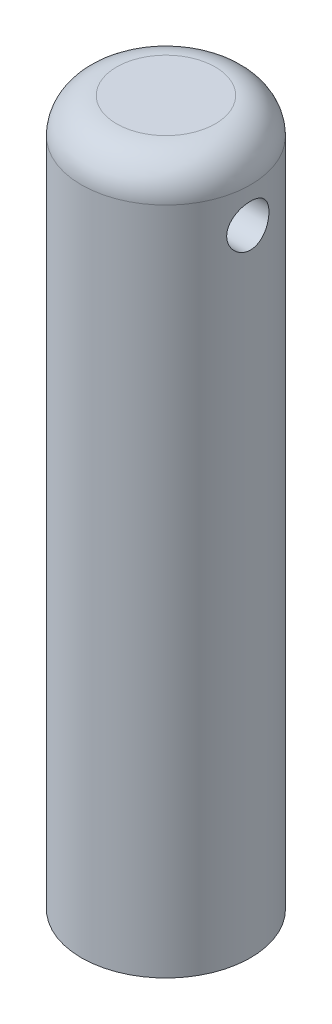
ISO-10303-21;
HEADER;
FILE_DESCRIPTION(('STEP AP214'),'2;1');
FILE_NAME('part.step','',(''),(''),'','','');
FILE_SCHEMA(('AUTOMOTIVE_DESIGN { 1 0 10303 214 1 1 1 1 }'));
ENDSEC;
DATA;
#1=APPLICATION_CONTEXT('core data for automotive mechanical design processes');
#2=APPLICATION_PROTOCOL_DEFINITION('international standard','automotive_design',2000,#1);
#3=PRODUCT_CONTEXT('',#1,'mechanical');
#4=PRODUCT('Part','Part','',(#3));
#5=PRODUCT_RELATED_PRODUCT_CATEGORY('part','',(#4));
#6=PRODUCT_DEFINITION_FORMATION('','',#4);
#7=PRODUCT_DEFINITION_CONTEXT('part definition',#1,'design');
#8=PRODUCT_DEFINITION('design','',#6,#7);
#9=PRODUCT_DEFINITION_SHAPE('','',#8);
#10=(LENGTH_UNIT() NAMED_UNIT(*) SI_UNIT(.MILLI.,.METRE.));
#11=(NAMED_UNIT(*) PLANE_ANGLE_UNIT() SI_UNIT($,.RADIAN.));
#12=(NAMED_UNIT(*) SI_UNIT($,.STERADIAN.) SOLID_ANGLE_UNIT());
#13=UNCERTAINTY_MEASURE_WITH_UNIT(LENGTH_MEASURE(1.E-05),#10,'distance_accuracy_value','');
#14=(GEOMETRIC_REPRESENTATION_CONTEXT(3) GLOBAL_UNCERTAINTY_ASSIGNED_CONTEXT((#13)) GLOBAL_UNIT_ASSIGNED_CONTEXT((#10,
#11,#12)) REPRESENTATION_CONTEXT('',''));
#15=CARTESIAN_POINT('',(0.,0.,0.));
#16=DIRECTION('',(0.,0.,1.));
#17=DIRECTION('',(1.,0.,0.));
#18=AXIS2_PLACEMENT_3D('',#15,#16,#17);
#19=CARTESIAN_POINT('',(0.,80.,0.));
#20=DIRECTION('',(0.,-1.,0.));
#21=DIRECTION('',(0.,0.,-1.));
#22=AXIS2_PLACEMENT_3D('',#19,#20,#21);
#23=CYLINDRICAL_SURFACE('',#22,6.);
#24=CARTESIAN_POINT('',(0.,80.,0.));
#25=DIRECTION('',(0.,1.,0.));
#26=DIRECTION('',(0.,0.,1.));
#27=AXIS2_PLACEMENT_3D('',#24,#25,#26);
#28=CIRCLE('',#27,6.);
#29=CARTESIAN_POINT('',(0.,80.,6.));
#30=VERTEX_POINT('',#29);
#31=EDGE_CURVE('E448',#30,#30,#28,.T.);
#32=ORIENTED_EDGE('',*,*,#31,.T.);
#33=EDGE_LOOP('',(#32));
#34=FACE_BOUND('',#33,.T.);
#35=CARTESIAN_POINT('',(0.,17.,0.));
#36=DIRECTION('',(0.,-1.,0.));
#37=DIRECTION('',(0.,0.,-1.));
#38=AXIS2_PLACEMENT_3D('',#35,#36,#37);
#39=CIRCLE('',#38,6.);
#40=CARTESIAN_POINT('',(0.,17.,-6.));
#41=VERTEX_POINT('',#40);
#42=EDGE_CURVE('E168',#41,#41,#39,.T.);
#43=ORIENTED_EDGE('',*,*,#42,.T.);
#44=EDGE_LOOP('',(#43));
#45=FACE_BOUND('',#44,.T.);
#46=ADVANCED_FACE('F32',(#34,#45),#23,.F.);
#47=CARTESIAN_POINT('',(0.,0.,0.));
#48=DIRECTION('',(0.,1.,0.));
#49=DIRECTION('',(0.,0.,1.));
#50=AXIS2_PLACEMENT_3D('',#47,#48,#49);
#51=PLANE('',#50);
#52=DIRECTION('',(-0.00445716423459127,0.,0.999990066794159));
#53=VECTOR('',#52,1.);
#54=CARTESIAN_POINT('',(6.88362585408213,0.,-3.93345923603692));
#55=LINE('',#54,#53);
#56=CARTESIAN_POINT('',(6.88105250911146,0.,-3.35611470178636));
#57=VERTEX_POINT('',#56);
#58=CARTESIAN_POINT('',(6.85086189517023,0.,3.41732070751345));
#59=VERTEX_POINT('',#58);
#60=EDGE_CURVE('E447',#57,#59,#55,.T.);
#61=ORIENTED_EDGE('',*,*,#60,.F.);
#62=CARTESIAN_POINT('',(5.8810624423173,0.,-3.36057186602095));
#63=DIRECTION('',(0.,1.,0.));
#64=DIRECTION('',(0.,0.,1.));
#65=AXIS2_PLACEMENT_3D('',#62,#63,#64);
#66=CIRCLE('',#65,1.);
#67=CARTESIAN_POINT('',(6.38491749317037,0.,-4.2243600852795));
#68=VERTEX_POINT('',#67);
#69=EDGE_CURVE('E206',#57,#68,#66,.T.);
#70=ORIENTED_EDGE('',*,*,#69,.T.);
#71=DIRECTION('',(0.863788219258543,0.,0.503855050853075));
#72=VECTOR('',#71,1.);
#73=CARTESIAN_POINT('',(0.0353373038825518,0.,-7.92812447780094));
#74=LINE('',#73,#72);
#75=CARTESIAN_POINT('',(0.534045664794298,0.,-7.63722362855836));
#76=VERTEX_POINT('',#75);
#77=EDGE_CURVE('E427',#76,#68,#74,.T.);
#78=ORIENTED_EDGE('',*,*,#77,.F.);
#79=CARTESIAN_POINT('',(0.030190613941224,0.,-6.77343540929982));
#80=DIRECTION('',(0.,1.,0.));
#81=DIRECTION('',(0.,0.,1.));
#82=AXIS2_PLACEMENT_3D('',#79,#80,#81);
#83=CIRCLE('',#82,1.);
#84=CARTESIAN_POINT('',(-0.46594440199986,0.,-7.64168079279295));
#85=VERTEX_POINT('',#84);
#86=EDGE_CURVE('E137',#76,#85,#83,.T.);
#87=ORIENTED_EDGE('',*,*,#86,.T.);
#88=DIRECTION('',(0.868245383493135,0.,-0.496135015941084));
#89=VECTOR('',#88,1.);
#90=CARTESIAN_POINT('',(-6.84828855019957,0.,-3.99466524176401));
#91=LINE('',#90,#89);
#92=CARTESIAN_POINT('',(-6.34700684431716,0.,-4.281108926772));
#93=VERTEX_POINT('',#92);
#94=EDGE_CURVE('E144',#93,#85,#91,.T.);
#95=ORIENTED_EDGE('',*,*,#94,.F.);
#96=CARTESIAN_POINT('',(-5.85087182837608,0.,-3.41286354327886));
#97=DIRECTION('',(0.,1.,0.));
#98=DIRECTION('',(0.,0.,1.));
#99=AXIS2_PLACEMENT_3D('',#96,#97,#98);
#100=CIRCLE('',#99,1.);
#101=CARTESIAN_POINT('',(-6.85086189517024,0.,-3.41732070751345));
#102=VERTEX_POINT('',#101);
#103=EDGE_CURVE('E129',#93,#102,#100,.T.);
#104=ORIENTED_EDGE('',*,*,#103,.T.);
#105=DIRECTION('',(0.00445716423459127,0.,-0.999990066794159));
#106=VECTOR('',#105,1.);
#107=CARTESIAN_POINT('',(-6.88362585408213,0.,3.93345923603692));
#108=LINE('',#107,#106);
#109=CARTESIAN_POINT('',(-6.88105250911146,0.,3.35611470178637));
#110=VERTEX_POINT('',#109);
#111=EDGE_CURVE('E156',#110,#102,#108,.T.);
#112=ORIENTED_EDGE('',*,*,#111,.F.);
#113=CARTESIAN_POINT('',(-5.8810624423173,0.,3.36057186602096));
#114=DIRECTION('',(0.,1.,0.));
#115=DIRECTION('',(0.,0.,1.));
#116=AXIS2_PLACEMENT_3D('',#113,#114,#115);
#117=CIRCLE('',#116,1.);
#118=CARTESIAN_POINT('',(-6.38491749317038,0.,4.2243600852795));
#119=VERTEX_POINT('',#118);
#120=EDGE_CURVE('E53',#110,#119,#117,.T.);
#121=ORIENTED_EDGE('',*,*,#120,.T.);
#122=DIRECTION('',(-0.863788219258544,0.,-0.503855050853075));
#123=VECTOR('',#122,1.);
#124=CARTESIAN_POINT('',(-0.0353373038825544,0.,7.92812447780094));
#125=LINE('',#124,#123);
#126=CARTESIAN_POINT('',(-0.534045664794303,0.,7.63722362855836));
#127=VERTEX_POINT('',#126);
#128=EDGE_CURVE('E161',#127,#119,#125,.T.);
#129=ORIENTED_EDGE('',*,*,#128,.F.);
#130=CARTESIAN_POINT('',(-0.0301906139412279,0.,6.77343540929982));
#131=DIRECTION('',(0.,1.,0.));
#132=DIRECTION('',(0.,0.,1.));
#133=AXIS2_PLACEMENT_3D('',#130,#131,#132);
#134=CIRCLE('',#133,1.);
#135=CARTESIAN_POINT('',(0.465944401999855,0.,7.64168079279295));
#136=VERTEX_POINT('',#135);
#137=EDGE_CURVE('E61',#127,#136,#134,.T.);
#138=ORIENTED_EDGE('',*,*,#137,.T.);
#139=DIRECTION('',(-0.868245383493135,0.,0.496135015941084));
#140=VECTOR('',#139,1.);
#141=CARTESIAN_POINT('',(6.84828855019957,0.,3.99466524176401));
#142=LINE('',#141,#140);
#143=CARTESIAN_POINT('',(6.34700684431716,0.,4.281108926772));
#144=VERTEX_POINT('',#143);
#145=EDGE_CURVE('E450',#144,#136,#142,.T.);
#146=ORIENTED_EDGE('',*,*,#145,.F.);
#147=CARTESIAN_POINT('',(5.85087182837608,0.,3.41286354327886));
#148=DIRECTION('',(0.,1.,0.));
#149=DIRECTION('',(0.,0.,1.));
#150=AXIS2_PLACEMENT_3D('',#147,#148,#149);
#151=CIRCLE('',#150,1.);
#152=EDGE_CURVE('E208',#144,#59,#151,.T.);
#153=ORIENTED_EDGE('',*,*,#152,.T.);
#154=EDGE_LOOP('',(#61,#70,#78,#87,#95,#104,#112,#121,#129,#138,#146,#153));
#155=FACE_BOUND('',#154,.T.);
#156=CARTESIAN_POINT('',(0.,0.,0.));
#157=DIRECTION('',(0.,1.,0.));
#158=DIRECTION('',(0.,0.,1.));
#159=AXIS2_PLACEMENT_3D('',#156,#157,#158);
#160=CIRCLE('',#159,12.);
#161=CARTESIAN_POINT('',(0.,0.,12.));
#162=VERTEX_POINT('',#161);
#163=EDGE_CURVE('E165',#162,#162,#160,.T.);
#164=ORIENTED_EDGE('',*,*,#163,.F.);
#165=EDGE_LOOP('',(#164));
#166=FACE_BOUND('',#165,.T.);
#167=ADVANCED_FACE('F152',(#155,#166),#51,.F.);
#168=CARTESIAN_POINT('',(0.,80.,0.));
#169=DIRECTION('',(0.,-1.,0.));
#170=DIRECTION('',(0.,0.,-1.));
#171=AXIS2_PLACEMENT_3D('',#168,#169,#170);
#172=CYLINDRICAL_SURFACE('',#171,12.);
#173=CARTESIAN_POINT('',(-11.6189500386223,90.,-3.));
#174=CARTESIAN_POINT('',(-11.6189532010543,90.1656609011119,-2.99999529431169));
#175=CARTESIAN_POINT('',(-11.6225316721752,90.3313738784142,-2.98623149459718));
#176=CARTESIAN_POINT('',(-11.6364223439108,90.6580410938082,-2.93162775055655));
#177=CARTESIAN_POINT('',(-11.6467384634596,90.8189925053618,-2.89077204809053));
#178=CARTESIAN_POINT('',(-11.6728646951538,91.1313642458246,-2.78338943955845));
#179=CARTESIAN_POINT('',(-11.6886677122855,91.2827965864629,-2.71689567342539));
#180=CARTESIAN_POINT('',(-11.7239783043451,91.5723730230479,-2.56022536951367));
#181=CARTESIAN_POINT('',(-11.7434860365419,91.7105165544963,-2.47004782627283));
#182=CARTESIAN_POINT('',(-11.7844885962675,91.9726339743147,-2.26645011277426));
#183=CARTESIAN_POINT('',(-11.8060151714764,92.0962723204201,-2.15260426524486));
#184=CARTESIAN_POINT('',(-11.8483545061835,92.3229136732324,-1.9058184769208));
#185=CARTESIAN_POINT('',(-11.8691671987967,92.4259147507461,-1.77287675301637));
#186=CARTESIAN_POINT('',(-11.908084986247,92.6097305611575,-1.48937424129475));
#187=CARTESIAN_POINT('',(-11.9261482488071,92.6902156657938,-1.33859349143414));
#188=CARTESIAN_POINT('',(-11.9571697431118,92.8245715729837,-1.02511582115131));
#189=CARTESIAN_POINT('',(-11.9701287280121,92.8784463022986,-0.862420662950327));
#190=CARTESIAN_POINT('',(-11.9892571061782,92.9569774014943,-0.533230510504993));
#191=CARTESIAN_POINT('',(-11.9955587261318,92.9822035731919,-0.36687926345877));
#192=CARTESIAN_POINT('',(-12.0011231292876,93.0045100551307,-0.0321945831153228));
#193=CARTESIAN_POINT('',(-12.0003869531605,93.0015945266515,0.136138553445682));
#194=CARTESIAN_POINT('',(-11.9920571394424,92.9681101796998,0.466056741517162));
#195=CARTESIAN_POINT('',(-11.9846160280904,92.9381564099354,0.627708646803201));
#196=CARTESIAN_POINT('',(-11.9638900382983,92.8524344759418,0.943614742241058));
#197=CARTESIAN_POINT('',(-11.9506048487814,92.7966649375471,1.09786853811131));
#198=CARTESIAN_POINT('',(-11.9194501164106,92.6603969151755,1.39622011050542));
#199=CARTESIAN_POINT('',(-11.9015402363401,92.5796795464059,1.54021352929951));
#200=CARTESIAN_POINT('',(-11.8630788457163,92.3959731850605,1.81282686702146));
#201=CARTESIAN_POINT('',(-11.8425268758318,92.2929803177272,1.94144410525651));
#202=CARTESIAN_POINT('',(-11.8003645652323,92.0643495096212,2.18332210525486));
#203=CARTESIAN_POINT('',(-11.7787406343036,91.9381741291827,2.29607303722559));
#204=CARTESIAN_POINT('',(-11.7373805222079,91.6684800317517,2.49892912788907));
#205=CARTESIAN_POINT('',(-11.7176444292995,91.5249605046107,2.58903322813808));
#206=CARTESIAN_POINT('',(-11.6822459619518,91.2236519590214,2.74436438706776));
#207=CARTESIAN_POINT('',(-11.6666038046041,91.0657971236246,2.80946870091135));
#208=CARTESIAN_POINT('',(-11.641423681784,90.7408974383078,2.91205686190914));
#209=CARTESIAN_POINT('',(-11.6318844101128,90.5738545632185,2.94954661965919));
#210=CARTESIAN_POINT('',(-11.6202642720895,90.2400485981641,2.99499556639911));
#211=CARTESIAN_POINT('',(-11.6179930677232,90.0733946479908,3.00370856870295));
#212=CARTESIAN_POINT('',(-11.6206481203763,89.7410136760977,2.9934203886182));
#213=CARTESIAN_POINT('',(-11.6255737148436,89.5752865704607,2.97442175741977));
#214=CARTESIAN_POINT('',(-11.6418849838198,89.2522628820617,2.90991055672591));
#215=CARTESIAN_POINT('',(-11.6531636429104,89.094872728117,2.86483688193829));
#216=CARTESIAN_POINT('',(-11.6808086191537,88.789882250576,2.74994169800456));
#217=CARTESIAN_POINT('',(-11.6971755389569,88.6422830891331,2.680117257255));
#218=CARTESIAN_POINT('',(-11.7335536451461,88.3578704665597,2.51612480152392));
#219=CARTESIAN_POINT('',(-11.7536300232869,88.2213253919484,2.42150610460277));
#220=CARTESIAN_POINT('',(-11.7950049968534,87.9657739646382,2.21118087880336));
#221=CARTESIAN_POINT('',(-11.8163037927397,87.8467705000199,2.09547088441631));
#222=CARTESIAN_POINT('',(-11.8583688363813,87.6266267489149,1.84278816295418));
#223=CARTESIAN_POINT('',(-11.8791084247426,87.5260079249414,1.70535585759478));
#224=CARTESIAN_POINT('',(-11.9171665993643,87.3492769596585,1.41510804808403));
#225=CARTESIAN_POINT('',(-11.9344853640474,87.2731635400701,1.26229334687278));
#226=CARTESIAN_POINT('',(-11.9636413888599,87.1482647585665,0.946674605193275));
#227=CARTESIAN_POINT('',(-11.9755179602689,87.0992828587451,0.783952143083649));
#228=CARTESIAN_POINT('',(-11.9926235207495,87.0294475984699,0.452249280956423));
#229=CARTESIAN_POINT('',(-11.9978537927211,87.0085888095131,0.283270095123724));
#230=CARTESIAN_POINT('',(-12.0010250822642,86.9958972312734,-0.0512505793299682));
#231=CARTESIAN_POINT('',(-11.9991593663997,87.0032948727138,-0.216761480898065));
#232=CARTESIAN_POINT('',(-11.9887768937233,87.045143481883,-0.544102489244252));
#233=CARTESIAN_POINT('',(-11.9802603347151,87.0795936450395,-0.705932705342784));
#234=CARTESIAN_POINT('',(-11.9575629856167,87.1741566593126,-1.02051310693432));
#235=CARTESIAN_POINT('',(-11.9434129350718,87.2341303599431,-1.17330748374259));
#236=CARTESIAN_POINT('',(-11.9109386674097,87.3779117370587,-1.46675115912487));
#237=CARTESIAN_POINT('',(-11.8926139241627,87.4617224180114,-1.6073989237969));
#238=CARTESIAN_POINT('',(-11.8532174904086,87.6531457019884,-1.87620578526991));
#239=CARTESIAN_POINT('',(-11.8320905082499,87.7612804287115,-2.00398496489501));
#240=CARTESIAN_POINT('',(-11.7897194717157,87.997268555932,-2.23984506082052));
#241=CARTESIAN_POINT('',(-11.7684753890191,88.1251269483335,-2.34792097522978));
#242=CARTESIAN_POINT('',(-11.7278242753651,88.3998042425684,-2.5432860794155));
#243=CARTESIAN_POINT('',(-11.7084589101987,88.5469323700958,-2.63014985824914));
#244=CARTESIAN_POINT('',(-11.6743186648448,88.8541664696245,-2.77778068975641));
#245=CARTESIAN_POINT('',(-11.6595404469964,89.0142628982815,-2.83856672925646));
#246=CARTESIAN_POINT('',(-11.6385572625221,89.3117310355055,-2.92326758571301));
#247=CARTESIAN_POINT('',(-11.631259890105,89.4476794931584,-2.95197951179064));
#248=CARTESIAN_POINT('',(-11.6214551574786,89.7224066069931,-2.99034687771531));
#249=CARTESIAN_POINT('',(-11.6189473886732,89.8611850207332,-3.00000394311525));
#250=CARTESIAN_POINT('',(-11.6189500386223,90.,-3.));
#251=B_SPLINE_CURVE_WITH_KNOTS('',3,(#173,#174,#175,#176,#177,#178,#179,#180,#181,#182,#183,
#184,#185,#186,#187,#188,#189,#190,#191,#192,#193,#194,#195,#196,#197,#198,#199,#200,#201,#202,
#203,#204,#205,#206,#207,#208,#209,#210,#211,#212,#213,#214,#215,#216,#217,#218,#219,#220,#221,
#222,#223,#224,#225,#226,#227,#228,#229,#230,#231,#232,#233,#234,#235,#236,#237,#238,#239,#240,
#241,#242,#243,#244,#245,#246,#247,#248,#249,#250),.UNSPECIFIED.,.T.,.F.,(4,2,2,2,2,2,2,2,2,2,2,
2,2,2,2,2,2,2,2,2,2,2,2,2,2,2,2,2,2,2,2,2,2,2,2,2,2,2,4),(0.,0.496472930083368,
0.993234889714398,1.48935687259922,1.98549992106574,2.49148745031572,2.9975222577584,
3.51061795677505,4.02363791816511,4.52626501194416,5.02881778399225,5.52021915226737,
6.01164668069743,6.50751449105333,7.00346862562696,7.51284559886294,8.02224637439762,
8.53411718410083,9.04587840155456,9.54412289717042,10.042321526265,10.5323688601698,
11.0224742571164,11.5221941503692,12.0219962266799,12.5343039716432,13.046584988694,
13.5551048737425,14.0635265869678,14.5582013535888,15.0528614085831,15.5448585187759,
16.0369176689162,16.5407651590442,17.0447403788455,17.5581177274936,18.0711206565002,
18.4871739262287,18.903191701295),.UNSPECIFIED.);
#252=CARTESIAN_POINT('',(-11.6189500386223,90.,-3.));
#253=VERTEX_POINT('',#252);
#254=EDGE_CURVE('E36',#253,#253,#251,.T.);
#255=ORIENTED_EDGE('',*,*,#254,.T.);
#256=EDGE_LOOP('',(#255));
#257=FACE_BOUND('',#256,.T.);
#258=CARTESIAN_POINT('',(11.6189500386222,90.,-3.));
#259=CARTESIAN_POINT('',(11.6189532010543,89.8343390988881,-2.99999529431169));
#260=CARTESIAN_POINT('',(11.6225316721752,89.6686261215858,-2.98623149459718));
#261=CARTESIAN_POINT('',(11.6364223439108,89.3419589061918,-2.93162775055655));
#262=CARTESIAN_POINT('',(11.6467384634596,89.1810074946382,-2.89077204809053));
#263=CARTESIAN_POINT('',(11.6728646951538,88.8686357541754,-2.78338943955845));
#264=CARTESIAN_POINT('',(11.6886677122855,88.7172034135371,-2.71689567342539));
#265=CARTESIAN_POINT('',(11.7239783043451,88.4276269769521,-2.56022536951366));
#266=CARTESIAN_POINT('',(11.7434860365419,88.2894834455037,-2.47004782627283));
#267=CARTESIAN_POINT('',(11.7844885962675,88.0273660256853,-2.26645011277426));
#268=CARTESIAN_POINT('',(11.8060151714764,87.9037276795799,-2.15260426524486));
#269=CARTESIAN_POINT('',(11.8483545061835,87.6770863267676,-1.9058184769208));
#270=CARTESIAN_POINT('',(11.8691671987967,87.5740852492539,-1.77287675301637));
#271=CARTESIAN_POINT('',(11.908084986247,87.3902694388425,-1.48937424129475));
#272=CARTESIAN_POINT('',(11.9261482488071,87.3097843342062,-1.33859349143415));
#273=CARTESIAN_POINT('',(11.9571697431118,87.1754284270163,-1.02511582115132));
#274=CARTESIAN_POINT('',(11.9701287280121,87.1215536977014,-0.862420662950332));
#275=CARTESIAN_POINT('',(11.9892571061782,87.0430225985057,-0.533230510504999));
#276=CARTESIAN_POINT('',(11.9955587261318,87.0177964268081,-0.366879263458775));
#277=CARTESIAN_POINT('',(12.0011231292876,86.9954899448693,-0.0321945831153264));
#278=CARTESIAN_POINT('',(12.0003869531605,86.9984054733485,0.136138553445679));
#279=CARTESIAN_POINT('',(11.9920571394424,87.0318898203002,0.46605674151716));
#280=CARTESIAN_POINT('',(11.9846160280904,87.0618435900646,0.6277086468032));
#281=CARTESIAN_POINT('',(11.9638900382983,87.1475655240582,0.943614742241058));
#282=CARTESIAN_POINT('',(11.9506048487814,87.2033350624529,1.09786853811131));
#283=CARTESIAN_POINT('',(11.9194501164106,87.3396030848245,1.39622011050542));
#284=CARTESIAN_POINT('',(11.9015402363401,87.4203204535941,1.54021352929951));
#285=CARTESIAN_POINT('',(11.8630788457163,87.6040268149395,1.81282686702146));
#286=CARTESIAN_POINT('',(11.8425268758318,87.7070196822727,1.94144410525651));
#287=CARTESIAN_POINT('',(11.8003645652323,87.9356504903788,2.18332210525486));
#288=CARTESIAN_POINT('',(11.7787406343036,88.0618258708173,2.29607303722559));
#289=CARTESIAN_POINT('',(11.7373805222079,88.3315199682483,2.49892912788907));
#290=CARTESIAN_POINT('',(11.7176444292995,88.4750394953893,2.58903322813808));
#291=CARTESIAN_POINT('',(11.6822459619518,88.7763480409786,2.74436438706776));
#292=CARTESIAN_POINT('',(11.6666038046041,88.9342028763754,2.80946870091135));
#293=CARTESIAN_POINT('',(11.641423681784,89.2591025616922,2.91205686190915));
#294=CARTESIAN_POINT('',(11.6318844101128,89.4261454367815,2.94954661965919));
#295=CARTESIAN_POINT('',(11.6202642720895,89.7599514018359,2.99499556639911));
#296=CARTESIAN_POINT('',(11.6179930677232,89.9266053520092,3.00370856870295));
#297=CARTESIAN_POINT('',(11.6206481203763,90.2589863239023,2.99342038861819));
#298=CARTESIAN_POINT('',(11.6255737148436,90.4247134295393,2.97442175741976));
#299=CARTESIAN_POINT('',(11.6418849838198,90.7477371179383,2.9099105567259));
#300=CARTESIAN_POINT('',(11.6531636429104,90.905127271883,2.86483688193829));
#301=CARTESIAN_POINT('',(11.6808086191537,91.210117749424,2.74994169800456));
#302=CARTESIAN_POINT('',(11.6971755389569,91.3577169108669,2.680117257255));
#303=CARTESIAN_POINT('',(11.7335536451461,91.6421295334403,2.51612480152392));
#304=CARTESIAN_POINT('',(11.7536300232869,91.7786746080516,2.42150610460277));
#305=CARTESIAN_POINT('',(11.7950049968534,92.0342260353618,2.21118087880336));
#306=CARTESIAN_POINT('',(11.8163037927397,92.1532294999801,2.09547088441631));
#307=CARTESIAN_POINT('',(11.8583688363813,92.3733732510851,1.84278816295418));
#308=CARTESIAN_POINT('',(11.8791084247426,92.4739920750586,1.70535585759478));
#309=CARTESIAN_POINT('',(11.9171665993643,92.6507230403415,1.41510804808403));
#310=CARTESIAN_POINT('',(11.9344853640474,92.7268364599299,1.26229334687278));
#311=CARTESIAN_POINT('',(11.9636413888599,92.8517352414335,0.946674605193275));
#312=CARTESIAN_POINT('',(11.9755179602689,92.9007171412549,0.783952143083649));
#313=CARTESIAN_POINT('',(11.9926235207495,92.9705524015301,0.452249280956423));
#314=CARTESIAN_POINT('',(11.9978537927211,92.9914111904868,0.283270095123725));
#315=CARTESIAN_POINT('',(12.0010250822642,93.0041027687266,-0.0512505793299658));
#316=CARTESIAN_POINT('',(11.9991593663997,92.9967051272862,-0.216761480898062));
#317=CARTESIAN_POINT('',(11.9887768937233,92.954856518117,-0.54410248924425));
#318=CARTESIAN_POINT('',(11.9802603347151,92.9204063549605,-0.705932705342783));
#319=CARTESIAN_POINT('',(11.9575629856167,92.8258433406874,-1.02051310693432));
#320=CARTESIAN_POINT('',(11.9434129350718,92.7658696400569,-1.17330748374258));
#321=CARTESIAN_POINT('',(11.9109386674097,92.6220882629413,-1.46675115912487));
#322=CARTESIAN_POINT('',(11.8926139241627,92.5382775819886,-1.60739892379689));
#323=CARTESIAN_POINT('',(11.8532174904086,92.3468542980116,-1.87620578526991));
#324=CARTESIAN_POINT('',(11.8320905082499,92.2387195712885,-2.00398496489501));
#325=CARTESIAN_POINT('',(11.7897194717157,92.0027314440679,-2.23984506082051));
#326=CARTESIAN_POINT('',(11.7684753890191,91.8748730516665,-2.34792097522977));
#327=CARTESIAN_POINT('',(11.7278242753651,91.6001957574316,-2.5432860794155));
#328=CARTESIAN_POINT('',(11.7084589101987,91.4530676299042,-2.63014985824914));
#329=CARTESIAN_POINT('',(11.6743186648448,91.1458335303755,-2.77778068975641));
#330=CARTESIAN_POINT('',(11.6595404469964,90.9857371017185,-2.83856672925646));
#331=CARTESIAN_POINT('',(11.6385572625221,90.6882689644945,-2.92326758571301));
#332=CARTESIAN_POINT('',(11.631259890105,90.5523205068416,-2.95197951179063));
#333=CARTESIAN_POINT('',(11.6214551574786,90.2775933930069,-2.99034687771531));
#334=CARTESIAN_POINT('',(11.6189473886732,90.1388149792668,-3.00000394311525));
#335=CARTESIAN_POINT('',(11.6189500386222,90.,-3.));
#336=B_SPLINE_CURVE_WITH_KNOTS('',3,(#258,#259,#260,#261,#262,#263,#264,#265,#266,#267,#268,
#269,#270,#271,#272,#273,#274,#275,#276,#277,#278,#279,#280,#281,#282,#283,#284,#285,#286,#287,
#288,#289,#290,#291,#292,#293,#294,#295,#296,#297,#298,#299,#300,#301,#302,#303,#304,#305,#306,
#307,#308,#309,#310,#311,#312,#313,#314,#315,#316,#317,#318,#319,#320,#321,#322,#323,#324,#325,
#326,#327,#328,#329,#330,#331,#332,#333,#334,#335),.UNSPECIFIED.,.T.,.F.,(4,2,2,2,2,2,2,2,2,2,2,
2,2,2,2,2,2,2,2,2,2,2,2,2,2,2,2,2,2,2,2,2,2,2,2,2,2,2,4),(0.,0.496472930083368,
0.993234889714398,1.48935687259923,1.98549992106574,2.49148745031572,2.9975222577584,
3.51061795677504,4.02363791816511,4.52626501194416,5.02881778399225,5.52021915226737,
6.01164668069743,6.50751449105333,7.00346862562696,7.51284559886295,8.02224637439763,
8.53411718410082,9.04587840155457,9.54412289717046,10.042321526265,10.5323688601698,
11.0224742571163,11.5221941503692,12.0219962266799,12.5343039716432,13.046584988694,
13.5551048737425,14.0635265869678,14.5582013535888,15.0528614085831,15.5448585187759,
16.0369176689162,16.5407651590442,17.0447403788455,17.5581177274936,18.0711206565002,
18.4871739262287,18.903191701295),.UNSPECIFIED.);
#337=CARTESIAN_POINT('',(11.6189500386222,90.,-3.));
#338=VERTEX_POINT('',#337);
#339=EDGE_CURVE('E213',#338,#338,#336,.T.);
#340=ORIENTED_EDGE('',*,*,#339,.T.);
#341=EDGE_LOOP('',(#340));
#342=FACE_BOUND('',#341,.T.);
#343=CARTESIAN_POINT('',(0.,95.,0.));
#344=DIRECTION('',(0.,1.,0.));
#345=DIRECTION('',(0.,0.,1.));
#346=AXIS2_PLACEMENT_3D('',#343,#344,#345);
#347=CIRCLE('',#346,12.);
#348=CARTESIAN_POINT('',(0.,95.,12.));
#349=VERTEX_POINT('',#348);
#350=EDGE_CURVE('E11',#349,#349,#347,.F.);
#351=ORIENTED_EDGE('',*,*,#350,.T.);
#352=EDGE_LOOP('',(#351));
#353=FACE_BOUND('',#352,.T.);
#354=ORIENTED_EDGE('',*,*,#163,.T.);
#355=EDGE_LOOP('',(#354));
#356=FACE_BOUND('',#355,.T.);
#357=ADVANCED_FACE('F217',(#257,#342,#353,#356),#172,.T.);
#358=CARTESIAN_POINT('',(0.0353373038825518,17.,-7.92812447780094));
#359=DIRECTION('',(0.503855050853075,0.,-0.863788219258543));
#360=DIRECTION('',(-0.863788219258543,0.,-0.503855050853075));
#361=AXIS2_PLACEMENT_3D('',#358,#359,#360);
#362=PLANE('',#361);
#363=DIRECTION('',(0.863788219258543,0.,0.503855050853075));
#364=VECTOR('',#363,1.);
#365=CARTESIAN_POINT('',(0.0353373038825518,17.,-7.92812447780094));
#366=LINE('',#365,#364);
#367=CARTESIAN_POINT('',(0.534045664794298,17.,-7.63722362855836));
#368=VERTEX_POINT('',#367);
#369=CARTESIAN_POINT('',(6.38491749317037,17.,-4.2243600852795));
#370=VERTEX_POINT('',#369);
#371=EDGE_CURVE('E155',#368,#370,#366,.T.);
#372=ORIENTED_EDGE('',*,*,#371,.F.);
#373=DIRECTION('',(0.,-1.,0.));
#374=VECTOR('',#373,1.);
#375=CARTESIAN_POINT('',(0.534045664794299,0.,-7.63722362855836));
#376=LINE('',#375,#374);
#377=EDGE_CURVE('E189',#368,#76,#376,.T.);
#378=ORIENTED_EDGE('',*,*,#377,.T.);
#379=ORIENTED_EDGE('',*,*,#77,.T.);
#380=DIRECTION('',(0.,-1.,0.));
#381=VECTOR('',#380,1.);
#382=CARTESIAN_POINT('',(6.38491749317038,17.,-4.2243600852795));
#383=LINE('',#382,#381);
#384=EDGE_CURVE('E187',#68,#370,#383,.F.);
#385=ORIENTED_EDGE('',*,*,#384,.T.);
#386=EDGE_LOOP('',(#372,#378,#379,#385));
#387=FACE_BOUND('',#386,.T.);
#388=ADVANCED_FACE('F244',(#387),#362,.F.);
#389=CARTESIAN_POINT('',(-6.84828855019957,17.,-3.99466524176401));
#390=DIRECTION('',(-0.496135015941084,0.,-0.868245383493135));
#391=DIRECTION('',(-0.868245383493135,0.,0.496135015941084));
#392=AXIS2_PLACEMENT_3D('',#389,#390,#391);
#393=PLANE('',#392);
#394=DIRECTION('',(0.868245383493135,0.,-0.496135015941084));
#395=VECTOR('',#394,1.);
#396=CARTESIAN_POINT('',(-6.84828855019957,17.,-3.99466524176401));
#397=LINE('',#396,#395);
#398=CARTESIAN_POINT('',(-6.34700684431716,17.,-4.281108926772));
#399=VERTEX_POINT('',#398);
#400=CARTESIAN_POINT('',(-0.46594440199986,17.,-7.64168079279295));
#401=VERTEX_POINT('',#400);
#402=EDGE_CURVE('E147',#399,#401,#397,.T.);
#403=ORIENTED_EDGE('',*,*,#402,.F.);
#404=DIRECTION('',(0.,-1.,0.));
#405=VECTOR('',#404,1.);
#406=CARTESIAN_POINT('',(-6.34700684431716,0.,-4.281108926772));
#407=LINE('',#406,#405);
#408=EDGE_CURVE('E133',#399,#93,#407,.T.);
#409=ORIENTED_EDGE('',*,*,#408,.T.);
#410=ORIENTED_EDGE('',*,*,#94,.T.);
#411=DIRECTION('',(0.,-1.,0.));
#412=VECTOR('',#411,1.);
#413=CARTESIAN_POINT('',(-0.46594440199986,17.,-7.64168079279295));
#414=LINE('',#413,#412);
#415=EDGE_CURVE('E149',#85,#401,#414,.F.);
#416=ORIENTED_EDGE('',*,*,#415,.T.);
#417=EDGE_LOOP('',(#403,#409,#410,#416));
#418=FACE_BOUND('',#417,.T.);
#419=ADVANCED_FACE('F143',(#418),#393,.F.);
#420=CARTESIAN_POINT('',(-6.88362585408213,17.,3.93345923603692));
#421=DIRECTION('',(-0.999990066794159,0.,-0.00445716423459127));
#422=DIRECTION('',(-0.00445716423459127,0.,0.999990066794159));
#423=AXIS2_PLACEMENT_3D('',#420,#421,#422);
#424=PLANE('',#423);
#425=ORIENTED_EDGE('',*,*,#111,.T.);
#426=DIRECTION('',(0.,-1.,0.));
#427=VECTOR('',#426,1.);
#428=CARTESIAN_POINT('',(-6.85086189517024,17.,-3.41732070751345));
#429=LINE('',#428,#427);
#430=CARTESIAN_POINT('',(-6.85086189517024,17.,-3.41732070751345));
#431=VERTEX_POINT('',#430);
#432=EDGE_CURVE('E134',#102,#431,#429,.F.);
#433=ORIENTED_EDGE('',*,*,#432,.T.);
#434=DIRECTION('',(0.00445716423459127,0.,-0.999990066794159));
#435=VECTOR('',#434,1.);
#436=CARTESIAN_POINT('',(-6.88362585408213,17.,3.93345923603692));
#437=LINE('',#436,#435);
#438=CARTESIAN_POINT('',(-6.88105250911146,17.,3.35611470178637));
#439=VERTEX_POINT('',#438);
#440=EDGE_CURVE('E443',#439,#431,#437,.T.);
#441=ORIENTED_EDGE('',*,*,#440,.F.);
#442=DIRECTION('',(0.,-1.,0.));
#443=VECTOR('',#442,1.);
#444=CARTESIAN_POINT('',(-6.88105250911146,0.,3.35611470178637));
#445=LINE('',#444,#443);
#446=EDGE_CURVE('E148',#439,#110,#445,.T.);
#447=ORIENTED_EDGE('',*,*,#446,.T.);
#448=EDGE_LOOP('',(#425,#433,#441,#447));
#449=FACE_BOUND('',#448,.T.);
#450=ADVANCED_FACE('F243',(#449),#424,.F.);
#451=CARTESIAN_POINT('',(-0.0353373038825544,17.,7.92812447780094));
#452=DIRECTION('',(-0.503855050853075,0.,0.863788219258543));
#453=DIRECTION('',(0.863788219258544,0.,0.503855050853075));
#454=AXIS2_PLACEMENT_3D('',#451,#452,#453);
#455=PLANE('',#454);
#456=DIRECTION('',(-0.863788219258544,0.,-0.503855050853075));
#457=VECTOR('',#456,1.);
#458=CARTESIAN_POINT('',(-0.0353373038825544,17.,7.92812447780094));
#459=LINE('',#458,#457);
#460=CARTESIAN_POINT('',(-0.534045664794303,17.,7.63722362855836));
#461=VERTEX_POINT('',#460);
#462=CARTESIAN_POINT('',(-6.38491749317038,17.,4.2243600852795));
#463=VERTEX_POINT('',#462);
#464=EDGE_CURVE('E437',#461,#463,#459,.T.);
#465=ORIENTED_EDGE('',*,*,#464,.F.);
#466=DIRECTION('',(0.,-1.,0.));
#467=VECTOR('',#466,1.);
#468=CARTESIAN_POINT('',(-0.534045664794303,0.,7.63722362855836));
#469=LINE('',#468,#467);
#470=EDGE_CURVE('E138',#461,#127,#469,.T.);
#471=ORIENTED_EDGE('',*,*,#470,.T.);
#472=ORIENTED_EDGE('',*,*,#128,.T.);
#473=DIRECTION('',(0.,-1.,0.));
#474=VECTOR('',#473,1.);
#475=CARTESIAN_POINT('',(-6.38491749317038,17.,4.2243600852795));
#476=LINE('',#475,#474);
#477=EDGE_CURVE('E202',#119,#463,#476,.F.);
#478=ORIENTED_EDGE('',*,*,#477,.T.);
#479=EDGE_LOOP('',(#465,#471,#472,#478));
#480=FACE_BOUND('',#479,.T.);
#481=ADVANCED_FACE('F247',(#480),#455,.F.);
#482=CARTESIAN_POINT('',(6.84828855019957,17.,3.99466524176401));
#483=DIRECTION('',(0.496135015941084,0.,0.868245383493135));
#484=DIRECTION('',(0.868245383493135,0.,-0.496135015941084));
#485=AXIS2_PLACEMENT_3D('',#482,#483,#484);
#486=PLANE('',#485);
#487=DIRECTION('',(-0.868245383493135,0.,0.496135015941084));
#488=VECTOR('',#487,1.);
#489=CARTESIAN_POINT('',(6.84828855019957,17.,3.99466524176401));
#490=LINE('',#489,#488);
#491=CARTESIAN_POINT('',(6.34700684431716,17.,4.281108926772));
#492=VERTEX_POINT('',#491);
#493=CARTESIAN_POINT('',(0.465944401999855,17.,7.64168079279295));
#494=VERTEX_POINT('',#493);
#495=EDGE_CURVE('E434',#492,#494,#490,.T.);
#496=ORIENTED_EDGE('',*,*,#495,.F.);
#497=DIRECTION('',(0.,-1.,0.));
#498=VECTOR('',#497,1.);
#499=CARTESIAN_POINT('',(6.34700684431716,0.,4.281108926772));
#500=LINE('',#499,#498);
#501=EDGE_CURVE('E199',#492,#144,#500,.T.);
#502=ORIENTED_EDGE('',*,*,#501,.T.);
#503=ORIENTED_EDGE('',*,*,#145,.T.);
#504=DIRECTION('',(0.,-1.,0.));
#505=VECTOR('',#504,1.);
#506=CARTESIAN_POINT('',(0.465944401999856,17.,7.64168079279295));
#507=LINE('',#506,#505);
#508=EDGE_CURVE('E197',#136,#494,#507,.F.);
#509=ORIENTED_EDGE('',*,*,#508,.T.);
#510=EDGE_LOOP('',(#496,#502,#503,#509));
#511=FACE_BOUND('',#510,.T.);
#512=ADVANCED_FACE('F251',(#511),#486,.F.);
#513=CARTESIAN_POINT('',(6.88362585408213,17.,-3.93345923603692));
#514=DIRECTION('',(0.999990066794159,0.,0.00445716423459127));
#515=DIRECTION('',(0.00445716423459127,0.,-0.999990066794159));
#516=AXIS2_PLACEMENT_3D('',#513,#514,#515);
#517=PLANE('',#516);
#518=DIRECTION('',(-0.00445716423459127,0.,0.999990066794159));
#519=VECTOR('',#518,1.);
#520=CARTESIAN_POINT('',(6.88362585408213,17.,-3.93345923603692));
#521=LINE('',#520,#519);
#522=CARTESIAN_POINT('',(6.88105250911146,17.,-3.35611470178636));
#523=VERTEX_POINT('',#522);
#524=CARTESIAN_POINT('',(6.85086189517023,17.,3.41732070751345));
#525=VERTEX_POINT('',#524);
#526=EDGE_CURVE('E159',#523,#525,#521,.T.);
#527=ORIENTED_EDGE('',*,*,#526,.F.);
#528=DIRECTION('',(0.,-1.,0.));
#529=VECTOR('',#528,1.);
#530=CARTESIAN_POINT('',(6.88105250911146,0.,-3.35611470178636));
#531=LINE('',#530,#529);
#532=EDGE_CURVE('E194',#523,#57,#531,.T.);
#533=ORIENTED_EDGE('',*,*,#532,.T.);
#534=ORIENTED_EDGE('',*,*,#60,.T.);
#535=DIRECTION('',(0.,-1.,0.));
#536=VECTOR('',#535,1.);
#537=CARTESIAN_POINT('',(6.85086189517023,17.,3.41732070751345));
#538=LINE('',#537,#536);
#539=EDGE_CURVE('E192',#59,#525,#538,.F.);
#540=ORIENTED_EDGE('',*,*,#539,.T.);
#541=EDGE_LOOP('',(#527,#533,#534,#540));
#542=FACE_BOUND('',#541,.T.);
#543=ADVANCED_FACE('F239',(#542),#517,.F.);
#544=CARTESIAN_POINT('',(6.88362585408213,17.,-3.93345923603692));
#545=DIRECTION('',(0.,-1.,0.));
#546=DIRECTION('',(0.,0.,-1.));
#547=AXIS2_PLACEMENT_3D('',#544,#545,#546);
#548=PLANE('',#547);
#549=ORIENTED_EDGE('',*,*,#42,.F.);
#550=EDGE_LOOP('',(#549));
#551=FACE_BOUND('',#550,.T.);
#552=ORIENTED_EDGE('',*,*,#440,.T.);
#553=CARTESIAN_POINT('',(-5.85087182837608,17.,-3.41286354327886));
#554=DIRECTION('',(0.,-1.,0.));
#555=DIRECTION('',(0.,0.,-1.));
#556=AXIS2_PLACEMENT_3D('',#553,#554,#555);
#557=CIRCLE('',#556,1.);
#558=EDGE_CURVE('E185',#431,#399,#557,.T.);
#559=ORIENTED_EDGE('',*,*,#558,.T.);
#560=ORIENTED_EDGE('',*,*,#402,.T.);
#561=CARTESIAN_POINT('',(0.030190613941224,17.,-6.77343540929982));
#562=DIRECTION('',(0.,-1.,0.));
#563=DIRECTION('',(0.,0.,-1.));
#564=AXIS2_PLACEMENT_3D('',#561,#562,#563);
#565=CIRCLE('',#564,1.);
#566=EDGE_CURVE('E183',#401,#368,#565,.T.);
#567=ORIENTED_EDGE('',*,*,#566,.T.);
#568=ORIENTED_EDGE('',*,*,#371,.T.);
#569=CARTESIAN_POINT('',(5.8810624423173,17.,-3.36057186602095));
#570=DIRECTION('',(0.,-1.,0.));
#571=DIRECTION('',(0.,0.,-1.));
#572=AXIS2_PLACEMENT_3D('',#569,#570,#571);
#573=CIRCLE('',#572,1.);
#574=EDGE_CURVE('E181',#370,#523,#573,.T.);
#575=ORIENTED_EDGE('',*,*,#574,.T.);
#576=ORIENTED_EDGE('',*,*,#526,.T.);
#577=CARTESIAN_POINT('',(5.85087182837608,17.,3.41286354327886));
#578=DIRECTION('',(0.,-1.,0.));
#579=DIRECTION('',(0.,0.,-1.));
#580=AXIS2_PLACEMENT_3D('',#577,#578,#579);
#581=CIRCLE('',#580,1.);
#582=EDGE_CURVE('E179',#525,#492,#581,.T.);
#583=ORIENTED_EDGE('',*,*,#582,.T.);
#584=ORIENTED_EDGE('',*,*,#495,.T.);
#585=CARTESIAN_POINT('',(-0.0301906139412279,17.,6.77343540929982));
#586=DIRECTION('',(0.,-1.,0.));
#587=DIRECTION('',(0.,0.,-1.));
#588=AXIS2_PLACEMENT_3D('',#585,#586,#587);
#589=CIRCLE('',#588,1.);
#590=EDGE_CURVE('E177',#494,#461,#589,.T.);
#591=ORIENTED_EDGE('',*,*,#590,.T.);
#592=ORIENTED_EDGE('',*,*,#464,.T.);
#593=CARTESIAN_POINT('',(-5.8810624423173,17.,3.36057186602096));
#594=DIRECTION('',(0.,-1.,0.));
#595=DIRECTION('',(0.,0.,-1.));
#596=AXIS2_PLACEMENT_3D('',#593,#594,#595);
#597=CIRCLE('',#596,1.);
#598=EDGE_CURVE('E175',#463,#439,#597,.T.);
#599=ORIENTED_EDGE('',*,*,#598,.T.);
#600=EDGE_LOOP('',(#552,#559,#560,#567,#568,#575,#576,#583,#584,#591,#592,#599));
#601=FACE_BOUND('',#600,.T.);
#602=ADVANCED_FACE('F236',(#551,#601),#548,.T.);
#603=CARTESIAN_POINT('',(-5.85087182837608,17.,-3.41286354327886));
#604=DIRECTION('',(0.,1.,0.));
#605=DIRECTION('',(0.,0.,1.));
#606=AXIS2_PLACEMENT_3D('',#603,#604,#605);
#607=CYLINDRICAL_SURFACE('',#606,1.);
#608=ORIENTED_EDGE('',*,*,#558,.F.);
#609=ORIENTED_EDGE('',*,*,#432,.F.);
#610=ORIENTED_EDGE('',*,*,#103,.F.);
#611=ORIENTED_EDGE('',*,*,#408,.F.);
#612=EDGE_LOOP('',(#608,#609,#610,#611));
#613=FACE_BOUND('',#612,.T.);
#614=ADVANCED_FACE('F132',(#613),#607,.F.);
#615=CARTESIAN_POINT('',(0.030190613941224,17.,-6.77343540929982));
#616=DIRECTION('',(0.,1.,0.));
#617=DIRECTION('',(0.,0.,1.));
#618=AXIS2_PLACEMENT_3D('',#615,#616,#617);
#619=CYLINDRICAL_SURFACE('',#618,1.);
#620=ORIENTED_EDGE('',*,*,#566,.F.);
#621=ORIENTED_EDGE('',*,*,#415,.F.);
#622=ORIENTED_EDGE('',*,*,#86,.F.);
#623=ORIENTED_EDGE('',*,*,#377,.F.);
#624=EDGE_LOOP('',(#620,#621,#622,#623));
#625=FACE_BOUND('',#624,.T.);
#626=ADVANCED_FACE('F348',(#625),#619,.F.);
#627=CARTESIAN_POINT('',(5.8810624423173,17.,-3.36057186602095));
#628=DIRECTION('',(0.,1.,0.));
#629=DIRECTION('',(0.,0.,1.));
#630=AXIS2_PLACEMENT_3D('',#627,#628,#629);
#631=CYLINDRICAL_SURFACE('',#630,1.);
#632=ORIENTED_EDGE('',*,*,#574,.F.);
#633=ORIENTED_EDGE('',*,*,#384,.F.);
#634=ORIENTED_EDGE('',*,*,#69,.F.);
#635=ORIENTED_EDGE('',*,*,#532,.F.);
#636=EDGE_LOOP('',(#632,#633,#634,#635));
#637=FACE_BOUND('',#636,.T.);
#638=ADVANCED_FACE('F338',(#637),#631,.F.);
#639=CARTESIAN_POINT('',(5.85087182837608,17.,3.41286354327886));
#640=DIRECTION('',(0.,1.,0.));
#641=DIRECTION('',(0.,0.,1.));
#642=AXIS2_PLACEMENT_3D('',#639,#640,#641);
#643=CYLINDRICAL_SURFACE('',#642,1.);
#644=ORIENTED_EDGE('',*,*,#582,.F.);
#645=ORIENTED_EDGE('',*,*,#539,.F.);
#646=ORIENTED_EDGE('',*,*,#152,.F.);
#647=ORIENTED_EDGE('',*,*,#501,.F.);
#648=EDGE_LOOP('',(#644,#645,#646,#647));
#649=FACE_BOUND('',#648,.T.);
#650=ADVANCED_FACE('F329',(#649),#643,.F.);
#651=CARTESIAN_POINT('',(-0.0301906139412279,17.,6.77343540929982));
#652=DIRECTION('',(0.,1.,0.));
#653=DIRECTION('',(0.,0.,1.));
#654=AXIS2_PLACEMENT_3D('',#651,#652,#653);
#655=CYLINDRICAL_SURFACE('',#654,1.);
#656=ORIENTED_EDGE('',*,*,#590,.F.);
#657=ORIENTED_EDGE('',*,*,#508,.F.);
#658=ORIENTED_EDGE('',*,*,#137,.F.);
#659=ORIENTED_EDGE('',*,*,#470,.F.);
#660=EDGE_LOOP('',(#656,#657,#658,#659));
#661=FACE_BOUND('',#660,.T.);
#662=ADVANCED_FACE('F323',(#661),#655,.F.);
#663=CARTESIAN_POINT('',(-5.8810624423173,17.,3.36057186602096));
#664=DIRECTION('',(0.,1.,0.));
#665=DIRECTION('',(0.,0.,1.));
#666=AXIS2_PLACEMENT_3D('',#663,#664,#665);
#667=CYLINDRICAL_SURFACE('',#666,1.);
#668=ORIENTED_EDGE('',*,*,#598,.F.);
#669=ORIENTED_EDGE('',*,*,#477,.F.);
#670=ORIENTED_EDGE('',*,*,#120,.F.);
#671=ORIENTED_EDGE('',*,*,#446,.F.);
#672=EDGE_LOOP('',(#668,#669,#670,#671));
#673=FACE_BOUND('',#672,.T.);
#674=ADVANCED_FACE('F231',(#673),#667,.F.);
#675=CARTESIAN_POINT('',(0.,100.,0.));
#676=DIRECTION('',(0.,1.,0.));
#677=DIRECTION('',(0.,0.,1.));
#678=AXIS2_PLACEMENT_3D('',#675,#676,#677);
#679=PLANE('',#678);
#680=CARTESIAN_POINT('',(0.,100.,0.));
#681=DIRECTION('',(0.,1.,0.));
#682=DIRECTION('',(0.,0.,1.));
#683=AXIS2_PLACEMENT_3D('',#680,#681,#682);
#684=CIRCLE('',#683,7.);
#685=CARTESIAN_POINT('',(0.,100.,7.));
#686=VERTEX_POINT('',#685);
#687=EDGE_CURVE('E45',#686,#686,#684,.T.);
#688=ORIENTED_EDGE('',*,*,#687,.T.);
#689=EDGE_LOOP('',(#688));
#690=FACE_BOUND('',#689,.T.);
#691=ADVANCED_FACE('F226',(#690),#679,.T.);
#692=CARTESIAN_POINT('',(0.,80.,0.));
#693=DIRECTION('',(0.,1.,0.));
#694=DIRECTION('',(0.,0.,1.));
#695=AXIS2_PLACEMENT_3D('',#692,#693,#694);
#696=PLANE('',#695);
#697=ORIENTED_EDGE('',*,*,#31,.F.);
#698=EDGE_LOOP('',(#697));
#699=FACE_BOUND('',#698,.T.);
#700=ADVANCED_FACE('F230',(#699),#696,.F.);
#701=CARTESIAN_POINT('',(0.,95.,0.));
#702=DIRECTION('',(0.,1.,0.));
#703=DIRECTION('',(0.,0.,1.));
#704=AXIS2_PLACEMENT_3D('',#701,#702,#703);
#705=TOROIDAL_SURFACE('',#704,7.,5.);
#706=ORIENTED_EDGE('',*,*,#350,.F.);
#707=EDGE_LOOP('',(#706));
#708=FACE_BOUND('',#707,.T.);
#709=ORIENTED_EDGE('',*,*,#687,.F.);
#710=EDGE_LOOP('',(#709));
#711=FACE_BOUND('',#710,.T.);
#712=ADVANCED_FACE('F34',(#708,#711),#705,.T.);
#713=CARTESIAN_POINT('',(-22.5,90.,0.));
#714=DIRECTION('',(1.,0.,0.));
#715=DIRECTION('',(0.,0.,-1.));
#716=AXIS2_PLACEMENT_3D('',#713,#714,#715);
#717=CYLINDRICAL_SURFACE('',#716,3.);
#718=ORIENTED_EDGE('',*,*,#339,.F.);
#719=EDGE_LOOP('',(#718));
#720=FACE_BOUND('',#719,.T.);
#721=ORIENTED_EDGE('',*,*,#254,.F.);
#722=EDGE_LOOP('',(#721));
#723=FACE_BOUND('',#722,.T.);
#724=ADVANCED_FACE('F221',(#720,#723),#717,.F.);
#725=CLOSED_SHELL('',(#46,#167,#357,#388,#419,#450,#481,#512,#543,#602,#614,#626,#638,#650,#662,
#674,#691,#700,#712,#724));
#726=MANIFOLD_SOLID_BREP('B2',#725);
#727=ADVANCED_BREP_SHAPE_REPRESENTATION('',(#18,#726),#14);
#728=SHAPE_DEFINITION_REPRESENTATION(#9,#727);
ENDSEC;
END-ISO-10303-21;
